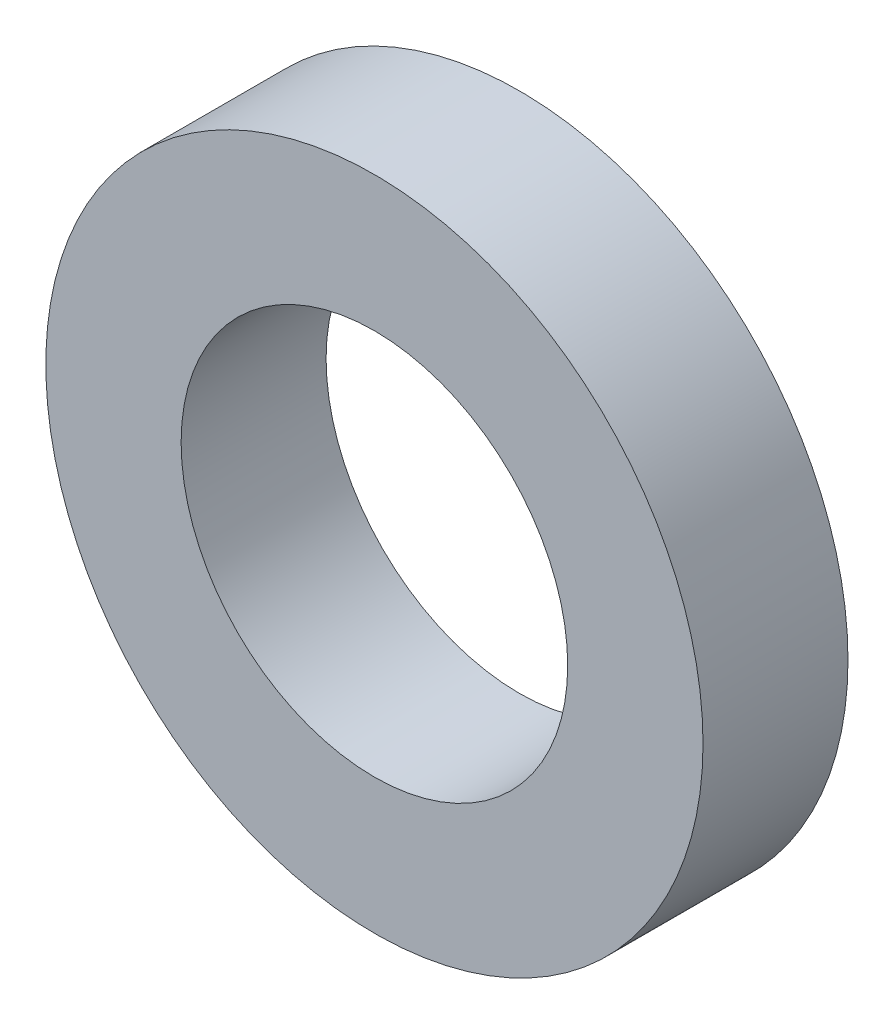
ISO-10303-21;
HEADER;
FILE_DESCRIPTION(('STEP AP214'),'2;1');
FILE_NAME('part.step','',(''),(''),'','','');
FILE_SCHEMA(('AUTOMOTIVE_DESIGN { 1 0 10303 214 1 1 1 1 }'));
ENDSEC;
DATA;
#1=APPLICATION_CONTEXT('core data for automotive mechanical design processes');
#2=APPLICATION_PROTOCOL_DEFINITION('international standard','automotive_design',2000,#1);
#3=PRODUCT_CONTEXT('',#1,'mechanical');
#4=PRODUCT('Part','Part','',(#3));
#5=PRODUCT_RELATED_PRODUCT_CATEGORY('part','',(#4));
#6=PRODUCT_DEFINITION_FORMATION('','',#4);
#7=PRODUCT_DEFINITION_CONTEXT('part definition',#1,'design');
#8=PRODUCT_DEFINITION('design','',#6,#7);
#9=PRODUCT_DEFINITION_SHAPE('','',#8);
#10=(LENGTH_UNIT() NAMED_UNIT(*) SI_UNIT(.MILLI.,.METRE.));
#11=(NAMED_UNIT(*) PLANE_ANGLE_UNIT() SI_UNIT($,.RADIAN.));
#12=(NAMED_UNIT(*) SI_UNIT($,.STERADIAN.) SOLID_ANGLE_UNIT());
#13=UNCERTAINTY_MEASURE_WITH_UNIT(LENGTH_MEASURE(1.E-05),#10,'distance_accuracy_value','');
#14=(GEOMETRIC_REPRESENTATION_CONTEXT(3) GLOBAL_UNCERTAINTY_ASSIGNED_CONTEXT((#13)) GLOBAL_UNIT_ASSIGNED_CONTEXT((#10,
#11,#12)) REPRESENTATION_CONTEXT('',''));
#15=CARTESIAN_POINT('',(0.,0.,0.));
#16=DIRECTION('',(0.,0.,1.));
#17=DIRECTION('',(1.,0.,0.));
#18=AXIS2_PLACEMENT_3D('',#15,#16,#17);
#19=CARTESIAN_POINT('',(0.,0.,15.));
#20=DIRECTION('',(0.,0.,1.));
#21=DIRECTION('',(1.,0.,0.));
#22=AXIS2_PLACEMENT_3D('',#19,#20,#21);
#23=PLANE('',#22);
#24=CARTESIAN_POINT('',(0.,0.,15.));
#25=DIRECTION('',(0.,0.,1.));
#26=DIRECTION('',(1.,0.,0.));
#27=AXIS2_PLACEMENT_3D('',#24,#25,#26);
#28=CIRCLE('',#27,34.);
#29=CARTESIAN_POINT('',(34.,0.,15.));
#30=VERTEX_POINT('',#29);
#31=EDGE_CURVE('E10',#30,#30,#28,.T.);
#32=ORIENTED_EDGE('',*,*,#31,.T.);
#33=EDGE_LOOP('',(#32));
#34=FACE_BOUND('',#33,.T.);
#35=CARTESIAN_POINT('',(0.,0.,15.));
#36=DIRECTION('',(0.,0.,1.));
#37=DIRECTION('',(1.,0.,0.));
#38=AXIS2_PLACEMENT_3D('',#35,#36,#37);
#39=CIRCLE('',#38,20.);
#40=CARTESIAN_POINT('',(20.,0.,15.));
#41=VERTEX_POINT('',#40);
#42=EDGE_CURVE('E41',#41,#41,#39,.T.);
#43=ORIENTED_EDGE('',*,*,#42,.F.);
#44=EDGE_LOOP('',(#43));
#45=FACE_BOUND('',#44,.T.);
#46=ADVANCED_FACE('F30',(#34,#45),#23,.T.);
#47=CARTESIAN_POINT('',(0.,0.,0.));
#48=DIRECTION('',(0.,0.,1.));
#49=DIRECTION('',(1.,0.,0.));
#50=AXIS2_PLACEMENT_3D('',#47,#48,#49);
#51=PLANE('',#50);
#52=CARTESIAN_POINT('',(0.,0.,0.));
#53=DIRECTION('',(0.,0.,1.));
#54=DIRECTION('',(1.,0.,0.));
#55=AXIS2_PLACEMENT_3D('',#52,#53,#54);
#56=CIRCLE('',#55,34.);
#57=CARTESIAN_POINT('',(34.,0.,0.));
#58=VERTEX_POINT('',#57);
#59=EDGE_CURVE('E34',#58,#58,#56,.T.);
#60=ORIENTED_EDGE('',*,*,#59,.F.);
#61=EDGE_LOOP('',(#60));
#62=FACE_BOUND('',#61,.T.);
#63=CARTESIAN_POINT('',(0.,0.,0.));
#64=DIRECTION('',(0.,0.,1.));
#65=DIRECTION('',(1.,0.,0.));
#66=AXIS2_PLACEMENT_3D('',#63,#64,#65);
#67=CIRCLE('',#66,20.);
#68=CARTESIAN_POINT('',(20.,0.,0.));
#69=VERTEX_POINT('',#68);
#70=EDGE_CURVE('E43',#69,#69,#67,.T.);
#71=ORIENTED_EDGE('',*,*,#70,.T.);
#72=EDGE_LOOP('',(#71));
#73=FACE_BOUND('',#72,.T.);
#74=ADVANCED_FACE('F53',(#62,#73),#51,.F.);
#75=CARTESIAN_POINT('',(0.,0.,15.));
#76=DIRECTION('',(0.,0.,-1.));
#77=DIRECTION('',(-1.,0.,0.));
#78=AXIS2_PLACEMENT_3D('',#75,#76,#77);
#79=CYLINDRICAL_SURFACE('',#78,34.);
#80=ORIENTED_EDGE('',*,*,#31,.F.);
#81=EDGE_LOOP('',(#80));
#82=FACE_BOUND('',#81,.T.);
#83=ORIENTED_EDGE('',*,*,#59,.T.);
#84=EDGE_LOOP('',(#83));
#85=FACE_BOUND('',#84,.T.);
#86=ADVANCED_FACE('F32',(#82,#85),#79,.T.);
#87=CARTESIAN_POINT('',(0.,0.,15.));
#88=DIRECTION('',(0.,0.,-1.));
#89=DIRECTION('',(-1.,0.,0.));
#90=AXIS2_PLACEMENT_3D('',#87,#88,#89);
#91=CYLINDRICAL_SURFACE('',#90,20.);
#92=ORIENTED_EDGE('',*,*,#42,.T.);
#93=EDGE_LOOP('',(#92));
#94=FACE_BOUND('',#93,.T.);
#95=ORIENTED_EDGE('',*,*,#70,.F.);
#96=EDGE_LOOP('',(#95));
#97=FACE_BOUND('',#96,.T.);
#98=ADVANCED_FACE('F49',(#94,#97),#91,.F.);
#99=CLOSED_SHELL('',(#46,#74,#86,#98));
#100=MANIFOLD_SOLID_BREP('B2',#99);
#101=ADVANCED_BREP_SHAPE_REPRESENTATION('',(#18,#100),#14);
#102=SHAPE_DEFINITION_REPRESENTATION(#9,#101);
ENDSEC;
END-ISO-10303-21;
